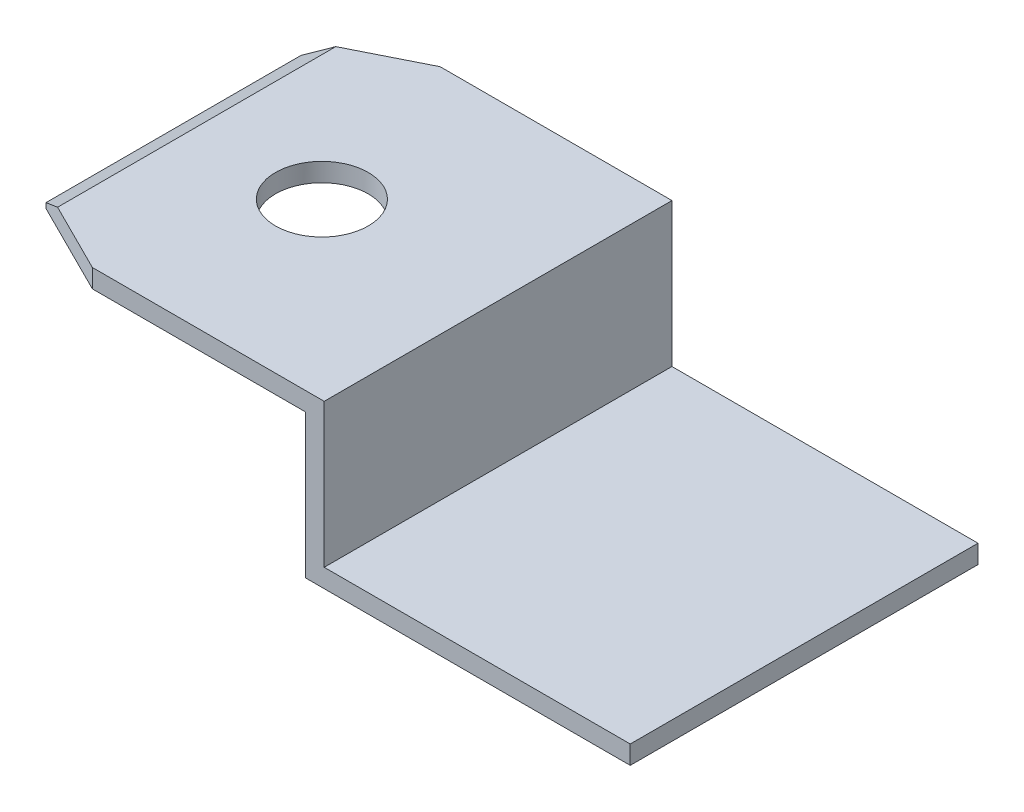
ISO-10303-21;
HEADER;
FILE_DESCRIPTION(('STEP AP214'),'2;1');
FILE_NAME('part.step','',(''),(''),'','','');
FILE_SCHEMA(('AUTOMOTIVE_DESIGN { 1 0 10303 214 1 1 1 1 }'));
ENDSEC;
DATA;
#1=APPLICATION_CONTEXT('core data for automotive mechanical design processes');
#2=APPLICATION_PROTOCOL_DEFINITION('international standard','automotive_design',2000,#1);
#3=PRODUCT_CONTEXT('',#1,'mechanical');
#4=PRODUCT('Part','Part','',(#3));
#5=PRODUCT_RELATED_PRODUCT_CATEGORY('part','',(#4));
#6=PRODUCT_DEFINITION_FORMATION('','',#4);
#7=PRODUCT_DEFINITION_CONTEXT('part definition',#1,'design');
#8=PRODUCT_DEFINITION('design','',#6,#7);
#9=PRODUCT_DEFINITION_SHAPE('','',#8);
#10=(LENGTH_UNIT() NAMED_UNIT(*) SI_UNIT(.MILLI.,.METRE.));
#11=(NAMED_UNIT(*) PLANE_ANGLE_UNIT() SI_UNIT($,.RADIAN.));
#12=(NAMED_UNIT(*) SI_UNIT($,.STERADIAN.) SOLID_ANGLE_UNIT());
#13=UNCERTAINTY_MEASURE_WITH_UNIT(LENGTH_MEASURE(1.E-05),#10,'distance_accuracy_value','');
#14=(GEOMETRIC_REPRESENTATION_CONTEXT(3) GLOBAL_UNCERTAINTY_ASSIGNED_CONTEXT((#13)) GLOBAL_UNIT_ASSIGNED_CONTEXT((#10,
#11,#12)) REPRESENTATION_CONTEXT('',''));
#15=CARTESIAN_POINT('',(0.,0.,0.));
#16=DIRECTION('',(0.,0.,1.));
#17=DIRECTION('',(1.,0.,0.));
#18=AXIS2_PLACEMENT_3D('',#15,#16,#17);
#19=CARTESIAN_POINT('',(0.,-4.,75.));
#20=DIRECTION('',(1.,0.,0.));
#21=DIRECTION('',(0.,0.,-1.));
#22=AXIS2_PLACEMENT_3D('',#19,#20,#21);
#23=PLANE('',#22);
#24=DIRECTION('',(0.,1.,0.));
#25=VECTOR('',#24,1.);
#26=CARTESIAN_POINT('',(0.,-4.,65.));
#27=LINE('',#26,#25);
#28=CARTESIAN_POINT('',(0.,-4.,65.));
#29=VERTEX_POINT('',#28);
#30=CARTESIAN_POINT('',(0.,-2.88675134594812,65.));
#31=VERTEX_POINT('',#30);
#32=EDGE_CURVE('E187',#29,#31,#27,.T.);
#33=ORIENTED_EDGE('',*,*,#32,.T.);
#34=DIRECTION('',(0.,0.,-1.));
#35=VECTOR('',#34,1.);
#36=CARTESIAN_POINT('',(0.,-2.88675134594812,75.));
#37=LINE('',#36,#35);
#38=CARTESIAN_POINT('',(0.,-2.88675134594812,10.));
#39=VERTEX_POINT('',#38);
#40=EDGE_CURVE('E200',#31,#39,#37,.T.);
#41=ORIENTED_EDGE('',*,*,#40,.T.);
#42=DIRECTION('',(0.,-1.,0.));
#43=VECTOR('',#42,1.);
#44=CARTESIAN_POINT('',(0.,-4.,10.));
#45=LINE('',#44,#43);
#46=CARTESIAN_POINT('',(0.,-4.,10.));
#47=VERTEX_POINT('',#46);
#48=EDGE_CURVE('E192',#39,#47,#45,.T.);
#49=ORIENTED_EDGE('',*,*,#48,.T.);
#50=DIRECTION('',(0.,0.,-1.));
#51=VECTOR('',#50,1.);
#52=CARTESIAN_POINT('',(0.,-4.,75.));
#53=LINE('',#52,#51);
#54=EDGE_CURVE('E137',#29,#47,#53,.T.);
#55=ORIENTED_EDGE('',*,*,#54,.F.);
#56=EDGE_LOOP('',(#33,#41,#49,#55));
#57=FACE_BOUND('',#56,.T.);
#58=ADVANCED_FACE('F35',(#57),#23,.F.);
#59=CARTESIAN_POINT('',(66.,-3.99999999999999,75.));
#60=DIRECTION('',(0.,1.,0.));
#61=DIRECTION('',(-1.,0.,0.));
#62=AXIS2_PLACEMENT_3D('',#59,#60,#61);
#63=PLANE('',#62);
#64=CARTESIAN_POINT('',(32.,-3.99999999999999,37.5));
#65=DIRECTION('',(0.,1.,0.));
#66=DIRECTION('',(-1.,0.,0.));
#67=AXIS2_PLACEMENT_3D('',#64,#65,#66);
#68=CIRCLE('',#67,10.);
#69=CARTESIAN_POINT('',(22.,-3.99999999999999,37.5));
#70=VERTEX_POINT('',#69);
#71=EDGE_CURVE('E159',#70,#70,#68,.T.);
#72=ORIENTED_EDGE('',*,*,#71,.T.);
#73=EDGE_LOOP('',(#72));
#74=FACE_BOUND('',#73,.T.);
#75=ORIENTED_EDGE('',*,*,#54,.T.);
#76=DIRECTION('',(0.894427190999917,0.,-0.447213595499956));
#77=VECTOR('',#76,1.);
#78=CARTESIAN_POINT('',(0.,-4.,10.));
#79=LINE('',#78,#77);
#80=CARTESIAN_POINT('',(20.0000000000001,-4.,0.));
#81=VERTEX_POINT('',#80);
#82=EDGE_CURVE('E194',#47,#81,#79,.T.);
#83=ORIENTED_EDGE('',*,*,#82,.T.);
#84=DIRECTION('',(1.,0.,0.));
#85=VECTOR('',#84,1.);
#86=CARTESIAN_POINT('',(66.,-3.99999999999999,0.));
#87=LINE('',#86,#85);
#88=CARTESIAN_POINT('',(66.,-3.99999999999999,0.));
#89=VERTEX_POINT('',#88);
#90=EDGE_CURVE('E134',#81,#89,#87,.T.);
#91=ORIENTED_EDGE('',*,*,#90,.T.);
#92=DIRECTION('',(0.,0.,-1.));
#93=VECTOR('',#92,1.);
#94=CARTESIAN_POINT('',(66.,-3.99999999999999,75.));
#95=LINE('',#94,#93);
#96=CARTESIAN_POINT('',(66.,-3.99999999999999,75.));
#97=VERTEX_POINT('',#96);
#98=EDGE_CURVE('E130',#97,#89,#95,.T.);
#99=ORIENTED_EDGE('',*,*,#98,.F.);
#100=DIRECTION('',(1.,0.,0.));
#101=VECTOR('',#100,1.);
#102=CARTESIAN_POINT('',(66.,-3.99999999999999,75.));
#103=LINE('',#102,#101);
#104=CARTESIAN_POINT('',(20.0000000000001,-4.,75.));
#105=VERTEX_POINT('',#104);
#106=EDGE_CURVE('E117',#105,#97,#103,.T.);
#107=ORIENTED_EDGE('',*,*,#106,.F.);
#108=DIRECTION('',(0.894427190999917,0.,0.447213595499955));
#109=VECTOR('',#108,1.);
#110=CARTESIAN_POINT('',(20.0000000000001,-4.,75.));
#111=LINE('',#110,#109);
#112=EDGE_CURVE('E185',#105,#29,#111,.F.);
#113=ORIENTED_EDGE('',*,*,#112,.T.);
#114=EDGE_LOOP('',(#75,#83,#91,#99,#107,#113));
#115=FACE_BOUND('',#114,.T.);
#116=ADVANCED_FACE('F132',(#74,#115),#63,.F.);
#117=CARTESIAN_POINT('',(66.,-35.,75.));
#118=DIRECTION('',(1.,0.,0.));
#119=DIRECTION('',(0.,0.,-1.));
#120=AXIS2_PLACEMENT_3D('',#117,#118,#119);
#121=PLANE('',#120);
#122=DIRECTION('',(0.,-1.,0.));
#123=VECTOR('',#122,1.);
#124=CARTESIAN_POINT('',(66.,-35.,0.));
#125=LINE('',#124,#123);
#126=CARTESIAN_POINT('',(66.,-35.,0.));
#127=VERTEX_POINT('',#126);
#128=EDGE_CURVE('E158',#89,#127,#125,.T.);
#129=ORIENTED_EDGE('',*,*,#128,.T.);
#130=DIRECTION('',(0.,0.,-1.));
#131=VECTOR('',#130,1.);
#132=CARTESIAN_POINT('',(66.,-35.,75.));
#133=LINE('',#132,#131);
#134=CARTESIAN_POINT('',(66.,-35.,75.));
#135=VERTEX_POINT('',#134);
#136=EDGE_CURVE('E138',#135,#127,#133,.T.);
#137=ORIENTED_EDGE('',*,*,#136,.F.);
#138=DIRECTION('',(0.,-1.,0.));
#139=VECTOR('',#138,1.);
#140=CARTESIAN_POINT('',(66.,-35.,75.));
#141=LINE('',#140,#139);
#142=EDGE_CURVE('E122',#97,#135,#141,.T.);
#143=ORIENTED_EDGE('',*,*,#142,.F.);
#144=ORIENTED_EDGE('',*,*,#98,.T.);
#145=EDGE_LOOP('',(#129,#137,#143,#144));
#146=FACE_BOUND('',#145,.T.);
#147=ADVANCED_FACE('F140',(#146),#121,.F.);
#148=CARTESIAN_POINT('',(136.,-35.,75.));
#149=DIRECTION('',(0.,1.,0.));
#150=DIRECTION('',(-1.,0.,0.));
#151=AXIS2_PLACEMENT_3D('',#148,#149,#150);
#152=PLANE('',#151);
#153=DIRECTION('',(1.,0.,0.));
#154=VECTOR('',#153,1.);
#155=CARTESIAN_POINT('',(136.,-35.,0.));
#156=LINE('',#155,#154);
#157=CARTESIAN_POINT('',(136.,-35.,0.));
#158=VERTEX_POINT('',#157);
#159=EDGE_CURVE('E161',#127,#158,#156,.T.);
#160=ORIENTED_EDGE('',*,*,#159,.T.);
#161=DIRECTION('',(0.,0.,-1.));
#162=VECTOR('',#161,1.);
#163=CARTESIAN_POINT('',(136.,-35.,75.));
#164=LINE('',#163,#162);
#165=CARTESIAN_POINT('',(136.,-35.,75.));
#166=VERTEX_POINT('',#165);
#167=EDGE_CURVE('E179',#166,#158,#164,.T.);
#168=ORIENTED_EDGE('',*,*,#167,.F.);
#169=DIRECTION('',(1.,0.,0.));
#170=VECTOR('',#169,1.);
#171=CARTESIAN_POINT('',(136.,-35.,75.));
#172=LINE('',#171,#170);
#173=EDGE_CURVE('E143',#135,#166,#172,.T.);
#174=ORIENTED_EDGE('',*,*,#173,.F.);
#175=ORIENTED_EDGE('',*,*,#136,.T.);
#176=EDGE_LOOP('',(#160,#168,#174,#175));
#177=FACE_BOUND('',#176,.T.);
#178=ADVANCED_FACE('F260',(#177),#152,.F.);
#179=CARTESIAN_POINT('',(136.,-31.,75.));
#180=DIRECTION('',(-1.,0.,0.));
#181=DIRECTION('',(0.,0.,1.));
#182=AXIS2_PLACEMENT_3D('',#179,#180,#181);
#183=PLANE('',#182);
#184=DIRECTION('',(0.,1.,0.));
#185=VECTOR('',#184,1.);
#186=CARTESIAN_POINT('',(136.,-31.,0.));
#187=LINE('',#186,#185);
#188=CARTESIAN_POINT('',(136.,-31.,0.));
#189=VERTEX_POINT('',#188);
#190=EDGE_CURVE('E163',#158,#189,#187,.T.);
#191=ORIENTED_EDGE('',*,*,#190,.T.);
#192=DIRECTION('',(0.,0.,-1.));
#193=VECTOR('',#192,1.);
#194=CARTESIAN_POINT('',(136.,-31.,75.));
#195=LINE('',#194,#193);
#196=CARTESIAN_POINT('',(136.,-31.,75.));
#197=VERTEX_POINT('',#196);
#198=EDGE_CURVE('E176',#197,#189,#195,.T.);
#199=ORIENTED_EDGE('',*,*,#198,.F.);
#200=DIRECTION('',(0.,1.,0.));
#201=VECTOR('',#200,1.);
#202=CARTESIAN_POINT('',(136.,-31.,75.));
#203=LINE('',#202,#201);
#204=EDGE_CURVE('E145',#166,#197,#203,.T.);
#205=ORIENTED_EDGE('',*,*,#204,.F.);
#206=ORIENTED_EDGE('',*,*,#167,.T.);
#207=EDGE_LOOP('',(#191,#199,#205,#206));
#208=FACE_BOUND('',#207,.T.);
#209=ADVANCED_FACE('F256',(#208),#183,.F.);
#210=CARTESIAN_POINT('',(70.,-31.,75.));
#211=DIRECTION('',(0.,-1.,0.));
#212=DIRECTION('',(0.,0.,-1.));
#213=AXIS2_PLACEMENT_3D('',#210,#211,#212);
#214=PLANE('',#213);
#215=DIRECTION('',(-1.,0.,0.));
#216=VECTOR('',#215,1.);
#217=CARTESIAN_POINT('',(70.,-31.,0.));
#218=LINE('',#217,#216);
#219=CARTESIAN_POINT('',(70.,-31.,0.));
#220=VERTEX_POINT('',#219);
#221=EDGE_CURVE('E165',#189,#220,#218,.T.);
#222=ORIENTED_EDGE('',*,*,#221,.T.);
#223=DIRECTION('',(0.,0.,-1.));
#224=VECTOR('',#223,1.);
#225=CARTESIAN_POINT('',(70.,-31.,75.));
#226=LINE('',#225,#224);
#227=CARTESIAN_POINT('',(70.,-31.,75.));
#228=VERTEX_POINT('',#227);
#229=EDGE_CURVE('E173',#228,#220,#226,.T.);
#230=ORIENTED_EDGE('',*,*,#229,.F.);
#231=DIRECTION('',(-1.,0.,0.));
#232=VECTOR('',#231,1.);
#233=CARTESIAN_POINT('',(70.,-31.,75.));
#234=LINE('',#233,#232);
#235=EDGE_CURVE('E150',#197,#228,#234,.T.);
#236=ORIENTED_EDGE('',*,*,#235,.F.);
#237=ORIENTED_EDGE('',*,*,#198,.T.);
#238=EDGE_LOOP('',(#222,#230,#236,#237));
#239=FACE_BOUND('',#238,.T.);
#240=ADVANCED_FACE('F252',(#239),#214,.F.);
#241=CARTESIAN_POINT('',(70.,0.,75.));
#242=DIRECTION('',(-1.,0.,0.));
#243=DIRECTION('',(0.,0.,1.));
#244=AXIS2_PLACEMENT_3D('',#241,#242,#243);
#245=PLANE('',#244);
#246=DIRECTION('',(0.,1.,0.));
#247=VECTOR('',#246,1.);
#248=CARTESIAN_POINT('',(70.,0.,0.));
#249=LINE('',#248,#247);
#250=CARTESIAN_POINT('',(70.,0.,0.));
#251=VERTEX_POINT('',#250);
#252=EDGE_CURVE('E167',#220,#251,#249,.T.);
#253=ORIENTED_EDGE('',*,*,#252,.T.);
#254=DIRECTION('',(0.,0.,-1.));
#255=VECTOR('',#254,1.);
#256=CARTESIAN_POINT('',(70.,0.,75.));
#257=LINE('',#256,#255);
#258=CARTESIAN_POINT('',(70.,0.,75.));
#259=VERTEX_POINT('',#258);
#260=EDGE_CURVE('E156',#259,#251,#257,.T.);
#261=ORIENTED_EDGE('',*,*,#260,.F.);
#262=DIRECTION('',(0.,1.,0.));
#263=VECTOR('',#262,1.);
#264=CARTESIAN_POINT('',(70.,0.,75.));
#265=LINE('',#264,#263);
#266=EDGE_CURVE('E152',#228,#259,#265,.T.);
#267=ORIENTED_EDGE('',*,*,#266,.F.);
#268=ORIENTED_EDGE('',*,*,#229,.T.);
#269=EDGE_LOOP('',(#253,#261,#267,#268));
#270=FACE_BOUND('',#269,.T.);
#271=ADVANCED_FACE('F248',(#270),#245,.F.);
#272=CARTESIAN_POINT('',(0.,0.,75.));
#273=DIRECTION('',(0.,-1.,0.));
#274=DIRECTION('',(0.,0.,-1.));
#275=AXIS2_PLACEMENT_3D('',#272,#273,#274);
#276=PLANE('',#275);
#277=CARTESIAN_POINT('',(32.,0.,37.5));
#278=DIRECTION('',(0.,1.,0.));
#279=DIRECTION('',(0.,0.,1.));
#280=AXIS2_PLACEMENT_3D('',#277,#278,#279);
#281=CIRCLE('',#280,10.);
#282=CARTESIAN_POINT('',(32.,0.,47.5));
#283=VERTEX_POINT('',#282);
#284=EDGE_CURVE('E355',#283,#283,#281,.T.);
#285=ORIENTED_EDGE('',*,*,#284,.F.);
#286=EDGE_LOOP('',(#285));
#287=FACE_BOUND('',#286,.T.);
#288=DIRECTION('',(-0.894427190999917,0.,0.447213595499956));
#289=VECTOR('',#288,1.);
#290=CARTESIAN_POINT('',(0.,0.,10.));
#291=LINE('',#290,#289);
#292=CARTESIAN_POINT('',(20.0000000000001,0.,0.));
#293=VERTEX_POINT('',#292);
#294=CARTESIAN_POINT('',(5.00000000000003,0.,7.50000000000002));
#295=VERTEX_POINT('',#294);
#296=EDGE_CURVE('E198',#293,#295,#291,.T.);
#297=ORIENTED_EDGE('',*,*,#296,.T.);
#298=DIRECTION('',(0.,0.,1.));
#299=VECTOR('',#298,1.);
#300=CARTESIAN_POINT('',(5.00000000000003,0.,75.));
#301=LINE('',#300,#299);
#302=CARTESIAN_POINT('',(5.00000000000003,0.,67.5));
#303=VERTEX_POINT('',#302);
#304=EDGE_CURVE('E43',#295,#303,#301,.T.);
#305=ORIENTED_EDGE('',*,*,#304,.T.);
#306=DIRECTION('',(-0.894427190999917,0.,-0.447213595499955));
#307=VECTOR('',#306,1.);
#308=CARTESIAN_POINT('',(20.0000000000001,0.,75.));
#309=LINE('',#308,#307);
#310=CARTESIAN_POINT('',(20.0000000000001,0.,75.));
#311=VERTEX_POINT('',#310);
#312=EDGE_CURVE('E190',#303,#311,#309,.F.);
#313=ORIENTED_EDGE('',*,*,#312,.T.);
#314=DIRECTION('',(-1.,0.,0.));
#315=VECTOR('',#314,1.);
#316=CARTESIAN_POINT('',(0.,0.,75.));
#317=LINE('',#316,#315);
#318=EDGE_CURVE('E154',#259,#311,#317,.T.);
#319=ORIENTED_EDGE('',*,*,#318,.F.);
#320=ORIENTED_EDGE('',*,*,#260,.T.);
#321=DIRECTION('',(-1.,0.,0.));
#322=VECTOR('',#321,1.);
#323=CARTESIAN_POINT('',(0.,0.,0.));
#324=LINE('',#323,#322);
#325=EDGE_CURVE('E127',#251,#293,#324,.T.);
#326=ORIENTED_EDGE('',*,*,#325,.T.);
#327=EDGE_LOOP('',(#297,#305,#313,#319,#320,#326));
#328=FACE_BOUND('',#327,.T.);
#329=ADVANCED_FACE('F244',(#287,#328),#276,.F.);
#330=CARTESIAN_POINT('',(0.,0.,75.));
#331=DIRECTION('',(0.,0.,-1.));
#332=DIRECTION('',(-1.,0.,0.));
#333=AXIS2_PLACEMENT_3D('',#330,#331,#332);
#334=PLANE('',#333);
#335=ORIENTED_EDGE('',*,*,#318,.T.);
#336=DIRECTION('',(0.,-1.,0.));
#337=VECTOR('',#336,1.);
#338=CARTESIAN_POINT('',(20.0000000000001,0.,75.));
#339=LINE('',#338,#337);
#340=EDGE_CURVE('E125',#311,#105,#339,.T.);
#341=ORIENTED_EDGE('',*,*,#340,.T.);
#342=ORIENTED_EDGE('',*,*,#106,.T.);
#343=ORIENTED_EDGE('',*,*,#142,.T.);
#344=ORIENTED_EDGE('',*,*,#173,.T.);
#345=ORIENTED_EDGE('',*,*,#204,.T.);
#346=ORIENTED_EDGE('',*,*,#235,.T.);
#347=ORIENTED_EDGE('',*,*,#266,.T.);
#348=EDGE_LOOP('',(#335,#341,#342,#343,#344,#345,#346,#347));
#349=FACE_BOUND('',#348,.T.);
#350=ADVANCED_FACE('F120',(#349),#334,.F.);
#351=CARTESIAN_POINT('',(0.,0.,0.));
#352=DIRECTION('',(0.,0.,-1.));
#353=DIRECTION('',(-1.,0.,0.));
#354=AXIS2_PLACEMENT_3D('',#351,#352,#353);
#355=PLANE('',#354);
#356=ORIENTED_EDGE('',*,*,#90,.F.);
#357=DIRECTION('',(0.,1.,0.));
#358=VECTOR('',#357,1.);
#359=CARTESIAN_POINT('',(20.0000000000001,0.,0.));
#360=LINE('',#359,#358);
#361=EDGE_CURVE('E196',#81,#293,#360,.T.);
#362=ORIENTED_EDGE('',*,*,#361,.T.);
#363=ORIENTED_EDGE('',*,*,#325,.F.);
#364=ORIENTED_EDGE('',*,*,#252,.F.);
#365=ORIENTED_EDGE('',*,*,#221,.F.);
#366=ORIENTED_EDGE('',*,*,#190,.F.);
#367=ORIENTED_EDGE('',*,*,#159,.F.);
#368=ORIENTED_EDGE('',*,*,#128,.F.);
#369=EDGE_LOOP('',(#356,#362,#363,#364,#365,#366,#367,#368));
#370=FACE_BOUND('',#369,.T.);
#371=ADVANCED_FACE('F232',(#370),#355,.T.);
#372=CARTESIAN_POINT('',(32.,-35.,37.5));
#373=DIRECTION('',(0.,1.,0.));
#374=DIRECTION('',(0.,0.,1.));
#375=AXIS2_PLACEMENT_3D('',#372,#373,#374);
#376=CYLINDRICAL_SURFACE('',#375,10.);
#377=ORIENTED_EDGE('',*,*,#284,.T.);
#378=EDGE_LOOP('',(#377));
#379=FACE_BOUND('',#378,.T.);
#380=ORIENTED_EDGE('',*,*,#71,.F.);
#381=EDGE_LOOP('',(#380));
#382=FACE_BOUND('',#381,.T.);
#383=ADVANCED_FACE('F228',(#379,#382),#376,.F.);
#384=CARTESIAN_POINT('',(20.0000000000001,0.,75.));
#385=DIRECTION('',(0.447213595499955,0.,-0.894427190999917));
#386=DIRECTION('',(0.,-1.,0.));
#387=AXIS2_PLACEMENT_3D('',#384,#385,#386);
#388=PLANE('',#387);
#389=ORIENTED_EDGE('',*,*,#312,.F.);
#390=DIRECTION('',(-0.794719414239029,-0.458831467741121,-0.397359707119512));
#391=VECTOR('',#390,1.);
#392=CARTESIAN_POINT('',(16.842105263158,6.8370426614561,73.421052631579));
#393=LINE('',#392,#391);
#394=EDGE_CURVE('E11',#303,#31,#393,.T.);
#395=ORIENTED_EDGE('',*,*,#394,.T.);
#396=ORIENTED_EDGE('',*,*,#32,.F.);
#397=ORIENTED_EDGE('',*,*,#112,.F.);
#398=ORIENTED_EDGE('',*,*,#340,.F.);
#399=EDGE_LOOP('',(#389,#395,#396,#397,#398));
#400=FACE_BOUND('',#399,.T.);
#401=ADVANCED_FACE('F213',(#400),#388,.F.);
#402=CARTESIAN_POINT('',(0.,-4.,10.));
#403=DIRECTION('',(-0.447213595499956,0.,-0.894427190999917));
#404=DIRECTION('',(0.,1.,0.));
#405=AXIS2_PLACEMENT_3D('',#402,#403,#404);
#406=PLANE('',#405);
#407=ORIENTED_EDGE('',*,*,#48,.F.);
#408=DIRECTION('',(-0.794719414239028,-0.458831467741121,0.397359707119512));
#409=VECTOR('',#408,1.);
#410=CARTESIAN_POINT('',(-0.405937522163265,-3.12111948364325,10.2029687610817));
#411=LINE('',#410,#409);
#412=EDGE_CURVE('E57',#39,#295,#411,.F.);
#413=ORIENTED_EDGE('',*,*,#412,.T.);
#414=ORIENTED_EDGE('',*,*,#296,.F.);
#415=ORIENTED_EDGE('',*,*,#361,.F.);
#416=ORIENTED_EDGE('',*,*,#82,.F.);
#417=EDGE_LOOP('',(#407,#413,#414,#415,#416));
#418=FACE_BOUND('',#417,.T.);
#419=ADVANCED_FACE('F210',(#418),#406,.T.);
#420=CARTESIAN_POINT('',(0.,-2.88675134594812,75.));
#421=DIRECTION('',(0.499999999999997,-0.86602540378444,0.));
#422=DIRECTION('',(0.,0.,-1.));
#423=AXIS2_PLACEMENT_3D('',#420,#421,#422);
#424=PLANE('',#423);
#425=ORIENTED_EDGE('',*,*,#394,.F.);
#426=ORIENTED_EDGE('',*,*,#304,.F.);
#427=ORIENTED_EDGE('',*,*,#412,.F.);
#428=ORIENTED_EDGE('',*,*,#40,.F.);
#429=EDGE_LOOP('',(#425,#426,#427,#428));
#430=FACE_BOUND('',#429,.T.);
#431=ADVANCED_FACE('F37',(#430),#424,.F.);
#432=CLOSED_SHELL('',(#58,#116,#147,#178,#209,#240,#271,#329,#350,#371,#383,#401,#419,#431));
#433=MANIFOLD_SOLID_BREP('B2',#432);
#434=ADVANCED_BREP_SHAPE_REPRESENTATION('',(#18,#433),#14);
#435=SHAPE_DEFINITION_REPRESENTATION(#9,#434);
ENDSEC;
END-ISO-10303-21;
